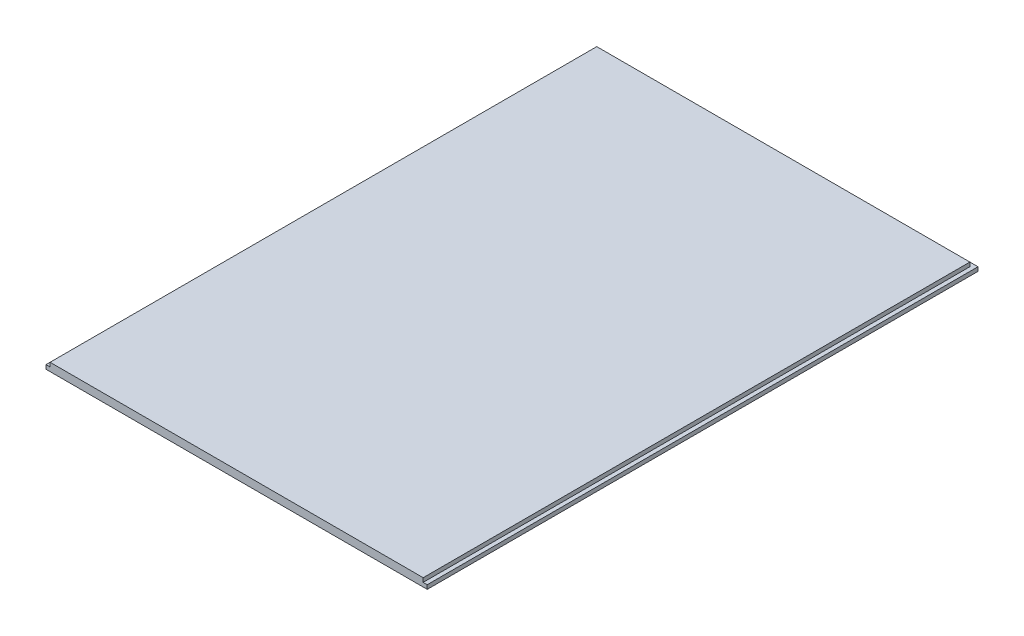
ISO-10303-21;
HEADER;
FILE_DESCRIPTION(('STEP AP214'),'2;1');
FILE_NAME('part.step','',(''),(''),'','','');
FILE_SCHEMA(('AUTOMOTIVE_DESIGN { 1 0 10303 214 1 1 1 1 }'));
ENDSEC;
DATA;
#1=APPLICATION_CONTEXT('core data for automotive mechanical design processes');
#2=APPLICATION_PROTOCOL_DEFINITION('international standard','automotive_design',2000,#1);
#3=PRODUCT_CONTEXT('',#1,'mechanical');
#4=PRODUCT('Part','Part','',(#3));
#5=PRODUCT_RELATED_PRODUCT_CATEGORY('part','',(#4));
#6=PRODUCT_DEFINITION_FORMATION('','',#4);
#7=PRODUCT_DEFINITION_CONTEXT('part definition',#1,'design');
#8=PRODUCT_DEFINITION('design','',#6,#7);
#9=PRODUCT_DEFINITION_SHAPE('','',#8);
#10=(LENGTH_UNIT() NAMED_UNIT(*) SI_UNIT(.MILLI.,.METRE.));
#11=(NAMED_UNIT(*) PLANE_ANGLE_UNIT() SI_UNIT($,.RADIAN.));
#12=(NAMED_UNIT(*) SI_UNIT($,.STERADIAN.) SOLID_ANGLE_UNIT());
#13=UNCERTAINTY_MEASURE_WITH_UNIT(LENGTH_MEASURE(1.E-05),#10,'distance_accuracy_value','');
#14=(GEOMETRIC_REPRESENTATION_CONTEXT(3) GLOBAL_UNCERTAINTY_ASSIGNED_CONTEXT((#13)) GLOBAL_UNIT_ASSIGNED_CONTEXT((#10,
#11,#12)) REPRESENTATION_CONTEXT('',''));
#15=CARTESIAN_POINT('',(0.,0.,0.));
#16=DIRECTION('',(0.,0.,1.));
#17=DIRECTION('',(1.,0.,0.));
#18=AXIS2_PLACEMENT_3D('',#15,#16,#17);
#19=CARTESIAN_POINT('',(0.,6.35,0.));
#20=DIRECTION('',(1.,0.,0.));
#21=DIRECTION('',(0.,0.,-1.));
#22=AXIS2_PLACEMENT_3D('',#19,#20,#21);
#23=PLANE('',#22);
#24=DIRECTION('',(0.,0.,1.));
#25=VECTOR('',#24,1.);
#26=CARTESIAN_POINT('',(0.,3.175,0.));
#27=LINE('',#26,#25);
#28=CARTESIAN_POINT('',(0.,3.175,-431.165));
#29=VERTEX_POINT('',#28);
#30=CARTESIAN_POINT('',(0.,3.175,0.));
#31=VERTEX_POINT('',#30);
#32=EDGE_CURVE('E131',#29,#31,#27,.T.);
#33=ORIENTED_EDGE('',*,*,#32,.F.);
#34=DIRECTION('',(0.,-1.,0.));
#35=VECTOR('',#34,1.);
#36=CARTESIAN_POINT('',(0.,6.35,-431.165));
#37=LINE('',#36,#35);
#38=CARTESIAN_POINT('',(0.,0.,-431.165));
#39=VERTEX_POINT('',#38);
#40=EDGE_CURVE('E55',#29,#39,#37,.T.);
#41=ORIENTED_EDGE('',*,*,#40,.T.);
#42=DIRECTION('',(0.,0.,1.));
#43=VECTOR('',#42,1.);
#44=CARTESIAN_POINT('',(0.,0.,0.));
#45=LINE('',#44,#43);
#46=CARTESIAN_POINT('',(0.,0.,0.));
#47=VERTEX_POINT('',#46);
#48=EDGE_CURVE('E109',#39,#47,#45,.T.);
#49=ORIENTED_EDGE('',*,*,#48,.T.);
#50=DIRECTION('',(0.,-1.,0.));
#51=VECTOR('',#50,1.);
#52=CARTESIAN_POINT('',(0.,6.35,0.));
#53=LINE('',#52,#51);
#54=EDGE_CURVE('E156',#31,#47,#53,.T.);
#55=ORIENTED_EDGE('',*,*,#54,.F.);
#56=EDGE_LOOP('',(#33,#41,#49,#55));
#57=FACE_BOUND('',#56,.T.);
#58=ADVANCED_FACE('F33',(#57),#23,.F.);
#59=CARTESIAN_POINT('',(0.,6.35,0.));
#60=DIRECTION('',(0.,0.,-1.));
#61=DIRECTION('',(-1.,0.,0.));
#62=AXIS2_PLACEMENT_3D('',#59,#60,#61);
#63=PLANE('',#62);
#64=DIRECTION('',(0.,-1.,0.));
#65=VECTOR('',#64,1.);
#66=CARTESIAN_POINT('',(3.175,6.350012,0.));
#67=LINE('',#66,#65);
#68=CARTESIAN_POINT('',(3.175,6.35,0.));
#69=VERTEX_POINT('',#68);
#70=CARTESIAN_POINT('',(3.175,3.175,0.));
#71=VERTEX_POINT('',#70);
#72=EDGE_CURVE('E110',#69,#71,#67,.T.);
#73=ORIENTED_EDGE('',*,*,#72,.T.);
#74=DIRECTION('',(1.,0.,0.));
#75=VECTOR('',#74,1.);
#76=CARTESIAN_POINT('',(0.,3.175,0.));
#77=LINE('',#76,#75);
#78=EDGE_CURVE('E126',#31,#71,#77,.T.);
#79=ORIENTED_EDGE('',*,*,#78,.F.);
#80=ORIENTED_EDGE('',*,*,#54,.T.);
#81=DIRECTION('',(1.,0.,0.));
#82=VECTOR('',#81,1.);
#83=CARTESIAN_POINT('',(0.,0.,0.));
#84=LINE('',#83,#82);
#85=CARTESIAN_POINT('',(298.45,0.,0.));
#86=VERTEX_POINT('',#85);
#87=EDGE_CURVE('E146',#47,#86,#84,.T.);
#88=ORIENTED_EDGE('',*,*,#87,.T.);
#89=DIRECTION('',(0.,-1.,0.));
#90=VECTOR('',#89,1.);
#91=CARTESIAN_POINT('',(298.45,6.35,0.));
#92=LINE('',#91,#90);
#93=CARTESIAN_POINT('',(298.45,3.175,0.));
#94=VERTEX_POINT('',#93);
#95=EDGE_CURVE('E123',#94,#86,#92,.T.);
#96=ORIENTED_EDGE('',*,*,#95,.F.);
#97=CARTESIAN_POINT('',(295.275,3.175,0.));
#98=VERTEX_POINT('',#97);
#99=EDGE_CURVE('E114',#98,#94,#77,.T.);
#100=ORIENTED_EDGE('',*,*,#99,.F.);
#101=DIRECTION('',(0.,-1.,0.));
#102=VECTOR('',#101,1.);
#103=CARTESIAN_POINT('',(295.275,6.350012,0.));
#104=LINE('',#103,#102);
#105=CARTESIAN_POINT('',(295.275,6.35,0.));
#106=VERTEX_POINT('',#105);
#107=EDGE_CURVE('E99',#106,#98,#104,.T.);
#108=ORIENTED_EDGE('',*,*,#107,.F.);
#109=DIRECTION('',(1.,0.,0.));
#110=VECTOR('',#109,1.);
#111=CARTESIAN_POINT('',(0.,6.35,0.));
#112=LINE('',#111,#110);
#113=EDGE_CURVE('E142',#69,#106,#112,.T.);
#114=ORIENTED_EDGE('',*,*,#113,.F.);
#115=EDGE_LOOP('',(#73,#79,#80,#88,#96,#100,#108,#114));
#116=FACE_BOUND('',#115,.T.);
#117=ADVANCED_FACE('F121',(#116),#63,.F.);
#118=CARTESIAN_POINT('',(298.45,6.35,0.));
#119=DIRECTION('',(-1.,0.,0.));
#120=DIRECTION('',(0.,0.,1.));
#121=AXIS2_PLACEMENT_3D('',#118,#119,#120);
#122=PLANE('',#121);
#123=DIRECTION('',(0.,0.,-1.));
#124=VECTOR('',#123,1.);
#125=CARTESIAN_POINT('',(298.45,3.175,0.));
#126=LINE('',#125,#124);
#127=CARTESIAN_POINT('',(298.45,3.175,-431.165));
#128=VERTEX_POINT('',#127);
#129=EDGE_CURVE('E124',#94,#128,#126,.T.);
#130=ORIENTED_EDGE('',*,*,#129,.F.);
#131=ORIENTED_EDGE('',*,*,#95,.T.);
#132=DIRECTION('',(0.,0.,-1.));
#133=VECTOR('',#132,1.);
#134=CARTESIAN_POINT('',(298.45,0.,0.));
#135=LINE('',#134,#133);
#136=CARTESIAN_POINT('',(298.45,0.,-431.165));
#137=VERTEX_POINT('',#136);
#138=EDGE_CURVE('E148',#86,#137,#135,.T.);
#139=ORIENTED_EDGE('',*,*,#138,.T.);
#140=DIRECTION('',(0.,-1.,0.));
#141=VECTOR('',#140,1.);
#142=CARTESIAN_POINT('',(298.45,6.35,-431.165));
#143=LINE('',#142,#141);
#144=EDGE_CURVE('E153',#128,#137,#143,.T.);
#145=ORIENTED_EDGE('',*,*,#144,.F.);
#146=EDGE_LOOP('',(#130,#131,#139,#145));
#147=FACE_BOUND('',#146,.T.);
#148=ADVANCED_FACE('F178',(#147),#122,.F.);
#149=CARTESIAN_POINT('',(0.,6.35,-431.165));
#150=DIRECTION('',(0.,0.,1.));
#151=DIRECTION('',(1.,0.,0.));
#152=AXIS2_PLACEMENT_3D('',#149,#150,#151);
#153=PLANE('',#152);
#154=DIRECTION('',(-1.,0.,0.));
#155=VECTOR('',#154,1.);
#156=CARTESIAN_POINT('',(0.,3.175,-431.165));
#157=LINE('',#156,#155);
#158=EDGE_CURVE('E127',#128,#29,#157,.T.);
#159=ORIENTED_EDGE('',*,*,#158,.F.);
#160=ORIENTED_EDGE('',*,*,#144,.T.);
#161=DIRECTION('',(-1.,0.,0.));
#162=VECTOR('',#161,1.);
#163=CARTESIAN_POINT('',(0.,0.,-431.165));
#164=LINE('',#163,#162);
#165=EDGE_CURVE('E144',#137,#39,#164,.T.);
#166=ORIENTED_EDGE('',*,*,#165,.T.);
#167=ORIENTED_EDGE('',*,*,#40,.F.);
#168=EDGE_LOOP('',(#159,#160,#166,#167));
#169=FACE_BOUND('',#168,.T.);
#170=ADVANCED_FACE('F182',(#169),#153,.F.);
#171=CARTESIAN_POINT('',(0.,6.35,0.));
#172=DIRECTION('',(0.,-1.,0.));
#173=DIRECTION('',(0.,0.,-1.));
#174=AXIS2_PLACEMENT_3D('',#171,#172,#173);
#175=PLANE('',#174);
#176=ORIENTED_EDGE('',*,*,#113,.T.);
#177=DIRECTION('',(0.,0.,-1.));
#178=VECTOR('',#177,1.);
#179=CARTESIAN_POINT('',(295.275,6.35,0.));
#180=LINE('',#179,#178);
#181=CARTESIAN_POINT('',(295.275,6.35,-427.99));
#182=VERTEX_POINT('',#181);
#183=EDGE_CURVE('E11',#106,#182,#180,.T.);
#184=ORIENTED_EDGE('',*,*,#183,.T.);
#185=DIRECTION('',(1.,0.,0.));
#186=VECTOR('',#185,1.);
#187=CARTESIAN_POINT('',(0.,6.35,-427.99));
#188=LINE('',#187,#186);
#189=CARTESIAN_POINT('',(3.175,6.35,-427.99));
#190=VERTEX_POINT('',#189);
#191=EDGE_CURVE('E158',#190,#182,#188,.T.);
#192=ORIENTED_EDGE('',*,*,#191,.F.);
#193=DIRECTION('',(0.,0.,-1.));
#194=VECTOR('',#193,1.);
#195=CARTESIAN_POINT('',(3.175,6.35,0.));
#196=LINE('',#195,#194);
#197=EDGE_CURVE('E40',#69,#190,#196,.T.);
#198=ORIENTED_EDGE('',*,*,#197,.F.);
#199=EDGE_LOOP('',(#176,#184,#192,#198));
#200=FACE_BOUND('',#199,.T.);
#201=ADVANCED_FACE('F164',(#200),#175,.F.);
#202=CARTESIAN_POINT('',(0.,0.,0.));
#203=DIRECTION('',(0.,-1.,0.));
#204=DIRECTION('',(0.,0.,-1.));
#205=AXIS2_PLACEMENT_3D('',#202,#203,#204);
#206=PLANE('',#205);
#207=ORIENTED_EDGE('',*,*,#48,.F.);
#208=ORIENTED_EDGE('',*,*,#165,.F.);
#209=ORIENTED_EDGE('',*,*,#138,.F.);
#210=ORIENTED_EDGE('',*,*,#87,.F.);
#211=EDGE_LOOP('',(#207,#208,#209,#210));
#212=FACE_BOUND('',#211,.T.);
#213=ADVANCED_FACE('F189',(#212),#206,.T.);
#214=CARTESIAN_POINT('',(295.275,6.350012,0.));
#215=DIRECTION('',(-1.,0.,0.));
#216=DIRECTION('',(0.,0.,1.));
#217=AXIS2_PLACEMENT_3D('',#214,#215,#216);
#218=PLANE('',#217);
#219=ORIENTED_EDGE('',*,*,#107,.T.);
#220=DIRECTION('',(0.,0.,-1.));
#221=VECTOR('',#220,1.);
#222=CARTESIAN_POINT('',(295.275,3.175,0.));
#223=LINE('',#222,#221);
#224=CARTESIAN_POINT('',(295.275,3.175,-427.99));
#225=VERTEX_POINT('',#224);
#226=EDGE_CURVE('E103',#98,#225,#223,.T.);
#227=ORIENTED_EDGE('',*,*,#226,.T.);
#228=DIRECTION('',(0.,-1.,0.));
#229=VECTOR('',#228,1.);
#230=CARTESIAN_POINT('',(295.275,6.350012,-427.99));
#231=LINE('',#230,#229);
#232=EDGE_CURVE('E138',#182,#225,#231,.T.);
#233=ORIENTED_EDGE('',*,*,#232,.F.);
#234=ORIENTED_EDGE('',*,*,#183,.F.);
#235=EDGE_LOOP('',(#219,#227,#233,#234));
#236=FACE_BOUND('',#235,.T.);
#237=ADVANCED_FACE('F101',(#236),#218,.F.);
#238=CARTESIAN_POINT('',(3.175,6.350012,0.));
#239=DIRECTION('',(-1.,0.,0.));
#240=DIRECTION('',(0.,0.,1.));
#241=AXIS2_PLACEMENT_3D('',#238,#239,#240);
#242=PLANE('',#241);
#243=ORIENTED_EDGE('',*,*,#197,.T.);
#244=DIRECTION('',(0.,-1.,0.));
#245=VECTOR('',#244,1.);
#246=CARTESIAN_POINT('',(3.175,6.350012,-427.99));
#247=LINE('',#246,#245);
#248=CARTESIAN_POINT('',(3.175,3.175,-427.99));
#249=VERTEX_POINT('',#248);
#250=EDGE_CURVE('E47',#190,#249,#247,.T.);
#251=ORIENTED_EDGE('',*,*,#250,.T.);
#252=DIRECTION('',(0.,0.,-1.));
#253=VECTOR('',#252,1.);
#254=CARTESIAN_POINT('',(3.175,3.175,0.));
#255=LINE('',#254,#253);
#256=EDGE_CURVE('E130',#71,#249,#255,.T.);
#257=ORIENTED_EDGE('',*,*,#256,.F.);
#258=ORIENTED_EDGE('',*,*,#72,.F.);
#259=EDGE_LOOP('',(#243,#251,#257,#258));
#260=FACE_BOUND('',#259,.T.);
#261=ADVANCED_FACE('F162',(#260),#242,.T.);
#262=CARTESIAN_POINT('',(0.,6.350012,-427.99));
#263=DIRECTION('',(0.,0.,-1.));
#264=DIRECTION('',(-1.,0.,0.));
#265=AXIS2_PLACEMENT_3D('',#262,#263,#264);
#266=PLANE('',#265);
#267=ORIENTED_EDGE('',*,*,#191,.T.);
#268=ORIENTED_EDGE('',*,*,#232,.T.);
#269=DIRECTION('',(1.,0.,0.));
#270=VECTOR('',#269,1.);
#271=CARTESIAN_POINT('',(0.,3.175,-427.99));
#272=LINE('',#271,#270);
#273=EDGE_CURVE('E117',#249,#225,#272,.T.);
#274=ORIENTED_EDGE('',*,*,#273,.F.);
#275=ORIENTED_EDGE('',*,*,#250,.F.);
#276=EDGE_LOOP('',(#267,#268,#274,#275));
#277=FACE_BOUND('',#276,.T.);
#278=ADVANCED_FACE('F165',(#277),#266,.T.);
#279=CARTESIAN_POINT('',(0.,3.175,0.));
#280=DIRECTION('',(0.,1.,0.));
#281=DIRECTION('',(0.,0.,1.));
#282=AXIS2_PLACEMENT_3D('',#279,#280,#281);
#283=PLANE('',#282);
#284=ORIENTED_EDGE('',*,*,#226,.F.);
#285=ORIENTED_EDGE('',*,*,#99,.T.);
#286=ORIENTED_EDGE('',*,*,#129,.T.);
#287=ORIENTED_EDGE('',*,*,#158,.T.);
#288=ORIENTED_EDGE('',*,*,#32,.T.);
#289=ORIENTED_EDGE('',*,*,#78,.T.);
#290=ORIENTED_EDGE('',*,*,#256,.T.);
#291=ORIENTED_EDGE('',*,*,#273,.T.);
#292=EDGE_LOOP('',(#284,#285,#286,#287,#288,#289,#290,#291));
#293=FACE_BOUND('',#292,.T.);
#294=ADVANCED_FACE('F113',(#293),#283,.T.);
#295=CLOSED_SHELL('',(#58,#117,#148,#170,#201,#213,#237,#261,#278,#294));
#296=MANIFOLD_SOLID_BREP('B2',#295);
#297=ADVANCED_BREP_SHAPE_REPRESENTATION('',(#18,#296),#14);
#298=SHAPE_DEFINITION_REPRESENTATION(#9,#297);
ENDSEC;
END-ISO-10303-21;
